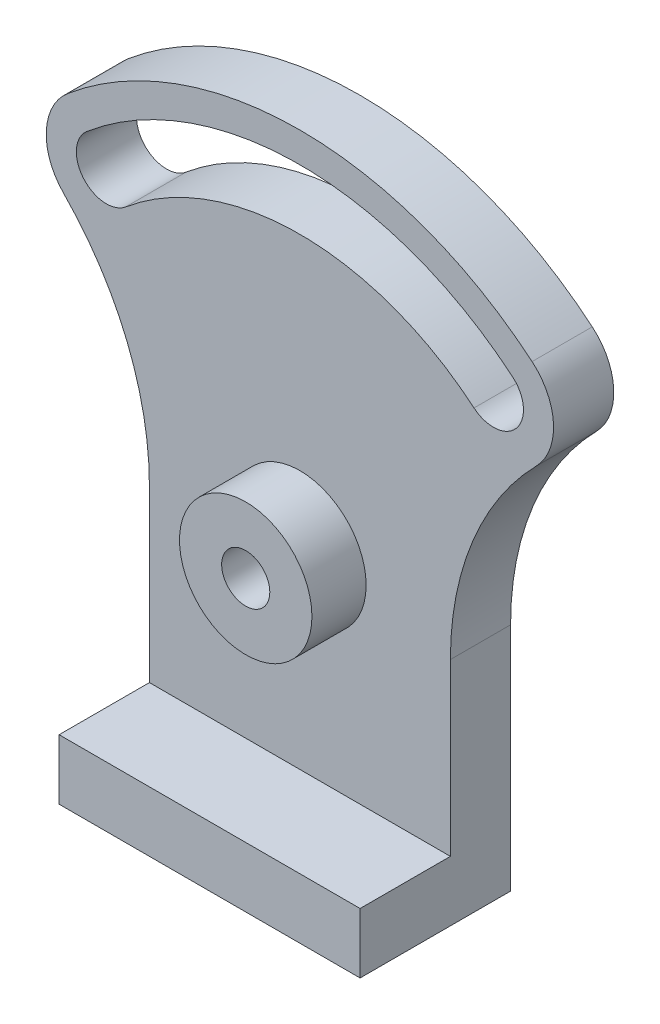
ISO-10303-21;
HEADER;
FILE_DESCRIPTION(('STEP AP214'),'2;1');
FILE_NAME('part.step','',(''),(''),'','','');
FILE_SCHEMA(('AUTOMOTIVE_DESIGN { 1 0 10303 214 1 1 1 1 }'));
ENDSEC;
DATA;
#1=APPLICATION_CONTEXT('core data for automotive mechanical design processes');
#2=APPLICATION_PROTOCOL_DEFINITION('international standard','automotive_design',2000,#1);
#3=PRODUCT_CONTEXT('',#1,'mechanical');
#4=PRODUCT('Part','Part','',(#3));
#5=PRODUCT_RELATED_PRODUCT_CATEGORY('part','',(#4));
#6=PRODUCT_DEFINITION_FORMATION('','',#4);
#7=PRODUCT_DEFINITION_CONTEXT('part definition',#1,'design');
#8=PRODUCT_DEFINITION('design','',#6,#7);
#9=PRODUCT_DEFINITION_SHAPE('','',#8);
#10=(LENGTH_UNIT() NAMED_UNIT(*) SI_UNIT(.MILLI.,.METRE.));
#11=(NAMED_UNIT(*) PLANE_ANGLE_UNIT() SI_UNIT($,.RADIAN.));
#12=(NAMED_UNIT(*) SI_UNIT($,.STERADIAN.) SOLID_ANGLE_UNIT());
#13=UNCERTAINTY_MEASURE_WITH_UNIT(LENGTH_MEASURE(1.E-05),#10,'distance_accuracy_value','');
#14=(GEOMETRIC_REPRESENTATION_CONTEXT(3) GLOBAL_UNCERTAINTY_ASSIGNED_CONTEXT((#13)) GLOBAL_UNIT_ASSIGNED_CONTEXT((#10,
#11,#12)) REPRESENTATION_CONTEXT('',''));
#15=CARTESIAN_POINT('',(0.,0.,0.));
#16=DIRECTION('',(0.,0.,1.));
#17=DIRECTION('',(1.,0.,0.));
#18=AXIS2_PLACEMENT_3D('',#15,#16,#17);
#19=CARTESIAN_POINT('',(-32.139380484327,38.3022221559488,10.));
#20=DIRECTION('',(0.,0.,-1.));
#21=DIRECTION('',(-1.,0.,0.));
#22=AXIS2_PLACEMENT_3D('',#19,#20,#21);
#23=CYLINDRICAL_SURFACE('',#22,5.);
#24=CARTESIAN_POINT('',(-32.139380484327,38.3022221559488,0.));
#25=DIRECTION('',(0.,0.,1.));
#26=DIRECTION('',(1.,0.,0.));
#27=AXIS2_PLACEMENT_3D('',#24,#25,#26);
#28=CIRCLE('',#27,5.);
#29=CARTESIAN_POINT('',(-35.3533185327598,42.1324443715437,0.));
#30=VERTEX_POINT('',#29);
#31=CARTESIAN_POINT('',(-28.9254424358944,34.471999940354,0.));
#32=VERTEX_POINT('',#31);
#33=EDGE_CURVE('E177',#30,#32,#28,.T.);
#34=ORIENTED_EDGE('',*,*,#33,.F.);
#35=DIRECTION('',(0.,0.,-1.));
#36=VECTOR('',#35,1.);
#37=CARTESIAN_POINT('',(-35.3533185327598,42.1324443715437,10.));
#38=LINE('',#37,#36);
#39=CARTESIAN_POINT('',(-35.3533185327598,42.1324443715437,10.));
#40=VERTEX_POINT('',#39);
#41=EDGE_CURVE('E11',#40,#30,#38,.T.);
#42=ORIENTED_EDGE('',*,*,#41,.F.);
#43=CARTESIAN_POINT('',(-32.139380484327,38.3022221559488,10.));
#44=DIRECTION('',(0.,0.,1.));
#45=DIRECTION('',(1.,0.,0.));
#46=AXIS2_PLACEMENT_3D('',#43,#44,#45);
#47=CIRCLE('',#46,5.);
#48=CARTESIAN_POINT('',(-28.9254424358944,34.471999940354,10.));
#49=VERTEX_POINT('',#48);
#50=EDGE_CURVE('E150',#40,#49,#47,.T.);
#51=ORIENTED_EDGE('',*,*,#50,.T.);
#52=DIRECTION('',(0.,0.,-1.));
#53=VECTOR('',#52,1.);
#54=CARTESIAN_POINT('',(-28.9254424358944,34.471999940354,10.));
#55=LINE('',#54,#53);
#56=EDGE_CURVE('E103',#49,#32,#55,.T.);
#57=ORIENTED_EDGE('',*,*,#56,.T.);
#58=EDGE_LOOP('',(#34,#42,#51,#57));
#59=FACE_BOUND('',#58,.T.);
#60=ADVANCED_FACE('F43',(#59),#23,.F.);
#61=CARTESIAN_POINT('',(0.,0.,10.));
#62=DIRECTION('',(0.,0.,-1.));
#63=DIRECTION('',(-1.,0.,0.));
#64=AXIS2_PLACEMENT_3D('',#61,#62,#63);
#65=CYLINDRICAL_SURFACE('',#64,55.);
#66=CARTESIAN_POINT('',(0.,0.,0.));
#67=DIRECTION('',(0.,0.,1.));
#68=DIRECTION('',(1.,0.,0.));
#69=AXIS2_PLACEMENT_3D('',#66,#67,#68);
#70=CIRCLE('',#69,55.);
#71=CARTESIAN_POINT('',(35.3533185327598,42.1324443715437,0.));
#72=VERTEX_POINT('',#71);
#73=EDGE_CURVE('E142',#72,#30,#70,.T.);
#74=ORIENTED_EDGE('',*,*,#73,.F.);
#75=DIRECTION('',(0.,0.,-1.));
#76=VECTOR('',#75,1.);
#77=CARTESIAN_POINT('',(35.3533185327598,42.1324443715437,10.));
#78=LINE('',#77,#76);
#79=CARTESIAN_POINT('',(35.3533185327598,42.1324443715437,10.));
#80=VERTEX_POINT('',#79);
#81=EDGE_CURVE('E53',#80,#72,#78,.T.);
#82=ORIENTED_EDGE('',*,*,#81,.F.);
#83=CARTESIAN_POINT('',(0.,0.,10.));
#84=DIRECTION('',(0.,0.,1.));
#85=DIRECTION('',(1.,0.,0.));
#86=AXIS2_PLACEMENT_3D('',#83,#84,#85);
#87=CIRCLE('',#86,55.);
#88=EDGE_CURVE('E140',#80,#40,#87,.T.);
#89=ORIENTED_EDGE('',*,*,#88,.T.);
#90=ORIENTED_EDGE('',*,*,#41,.T.);
#91=EDGE_LOOP('',(#74,#82,#89,#90));
#92=FACE_BOUND('',#91,.T.);
#93=ADVANCED_FACE('F139',(#92),#65,.F.);
#94=CARTESIAN_POINT('',(32.139380484327,38.3022221559488,10.));
#95=DIRECTION('',(0.,0.,-1.));
#96=DIRECTION('',(-1.,0.,0.));
#97=AXIS2_PLACEMENT_3D('',#94,#95,#96);
#98=CYLINDRICAL_SURFACE('',#97,5.);
#99=CARTESIAN_POINT('',(32.139380484327,38.3022221559488,0.));
#100=DIRECTION('',(0.,0.,1.));
#101=DIRECTION('',(1.,0.,0.));
#102=AXIS2_PLACEMENT_3D('',#99,#100,#101);
#103=CIRCLE('',#102,5.);
#104=CARTESIAN_POINT('',(28.9254424358943,34.471999940354,0.));
#105=VERTEX_POINT('',#104);
#106=EDGE_CURVE('E181',#105,#72,#103,.T.);
#107=ORIENTED_EDGE('',*,*,#106,.F.);
#108=DIRECTION('',(0.,0.,-1.));
#109=VECTOR('',#108,1.);
#110=CARTESIAN_POINT('',(28.9254424358943,34.471999940354,10.));
#111=LINE('',#110,#109);
#112=CARTESIAN_POINT('',(28.9254424358943,34.471999940354,10.));
#113=VERTEX_POINT('',#112);
#114=EDGE_CURVE('E96',#113,#105,#111,.T.);
#115=ORIENTED_EDGE('',*,*,#114,.F.);
#116=CARTESIAN_POINT('',(32.139380484327,38.3022221559488,10.));
#117=DIRECTION('',(0.,0.,1.));
#118=DIRECTION('',(1.,0.,0.));
#119=AXIS2_PLACEMENT_3D('',#116,#117,#118);
#120=CIRCLE('',#119,5.);
#121=EDGE_CURVE('E149',#113,#80,#120,.T.);
#122=ORIENTED_EDGE('',*,*,#121,.T.);
#123=ORIENTED_EDGE('',*,*,#81,.T.);
#124=EDGE_LOOP('',(#107,#115,#122,#123));
#125=FACE_BOUND('',#124,.T.);
#126=ADVANCED_FACE('F152',(#125),#98,.F.);
#127=CARTESIAN_POINT('',(75.,-3.68548193385244,10.));
#128=DIRECTION('',(0.,0.,-1.));
#129=DIRECTION('',(-1.,0.,0.));
#130=AXIS2_PLACEMENT_3D('',#127,#128,#129);
#131=CYLINDRICAL_SURFACE('',#130,50.);
#132=CARTESIAN_POINT('',(75.,-3.68548193385244,0.));
#133=DIRECTION('',(0.,0.,1.));
#134=DIRECTION('',(1.,0.,0.));
#135=AXIS2_PLACEMENT_3D('',#132,#133,#134);
#136=CIRCLE('',#135,50.);
#137=CARTESIAN_POINT('',(25.,-3.68548193385244,0.));
#138=VERTEX_POINT('',#137);
#139=CARTESIAN_POINT('',(39.2828170702725,31.3042714743153,0.));
#140=VERTEX_POINT('',#139);
#141=EDGE_CURVE('E158',#138,#140,#136,.F.);
#142=ORIENTED_EDGE('',*,*,#141,.T.);
#143=DIRECTION('',(0.,0.,-1.));
#144=VECTOR('',#143,1.);
#145=CARTESIAN_POINT('',(39.2828170702725,31.3042714743153,10.));
#146=LINE('',#145,#144);
#147=CARTESIAN_POINT('',(39.2828170702725,31.3042714743153,10.));
#148=VERTEX_POINT('',#147);
#149=EDGE_CURVE('E47',#148,#140,#146,.T.);
#150=ORIENTED_EDGE('',*,*,#149,.F.);
#151=CARTESIAN_POINT('',(75.,-3.68548193385244,10.));
#152=DIRECTION('',(0.,0.,1.));
#153=DIRECTION('',(1.,0.,0.));
#154=AXIS2_PLACEMENT_3D('',#151,#152,#153);
#155=CIRCLE('',#154,50.);
#156=CARTESIAN_POINT('',(25.,-3.68548193385244,10.));
#157=VERTEX_POINT('',#156);
#158=EDGE_CURVE('E185',#157,#148,#155,.F.);
#159=ORIENTED_EDGE('',*,*,#158,.F.);
#160=DIRECTION('',(0.,0.,-1.));
#161=VECTOR('',#160,1.);
#162=CARTESIAN_POINT('',(25.,-3.68548193385244,10.));
#163=LINE('',#162,#161);
#164=EDGE_CURVE('E154',#157,#138,#163,.T.);
#165=ORIENTED_EDGE('',*,*,#164,.T.);
#166=EDGE_LOOP('',(#142,#150,#159,#165));
#167=FACE_BOUND('',#166,.T.);
#168=ADVANCED_FACE('F45',(#167),#131,.F.);
#169=CARTESIAN_POINT('',(32.139380484327,38.3022221559488,10.));
#170=DIRECTION('',(0.,0.,-1.));
#171=DIRECTION('',(-1.,0.,0.));
#172=AXIS2_PLACEMENT_3D('',#169,#170,#171);
#173=CYLINDRICAL_SURFACE('',#172,10.);
#174=CARTESIAN_POINT('',(32.139380484327,38.3022221559488,0.));
#175=DIRECTION('',(0.,0.,1.));
#176=DIRECTION('',(1.,0.,0.));
#177=AXIS2_PLACEMENT_3D('',#174,#175,#176);
#178=CIRCLE('',#177,10.);
#179=CARTESIAN_POINT('',(38.5672565811925,45.9626665871386,0.));
#180=VERTEX_POINT('',#179);
#181=EDGE_CURVE('E161',#140,#180,#178,.T.);
#182=ORIENTED_EDGE('',*,*,#181,.T.);
#183=DIRECTION('',(0.,0.,-1.));
#184=VECTOR('',#183,1.);
#185=CARTESIAN_POINT('',(38.5672565811925,45.9626665871386,10.));
#186=LINE('',#185,#184);
#187=CARTESIAN_POINT('',(38.5672565811925,45.9626665871386,10.));
#188=VERTEX_POINT('',#187);
#189=EDGE_CURVE('E196',#188,#180,#186,.T.);
#190=ORIENTED_EDGE('',*,*,#189,.F.);
#191=CARTESIAN_POINT('',(32.139380484327,38.3022221559488,10.));
#192=DIRECTION('',(0.,0.,1.));
#193=DIRECTION('',(1.,0.,0.));
#194=AXIS2_PLACEMENT_3D('',#191,#192,#193);
#195=CIRCLE('',#194,10.);
#196=EDGE_CURVE('E111',#148,#188,#195,.T.);
#197=ORIENTED_EDGE('',*,*,#196,.F.);
#198=ORIENTED_EDGE('',*,*,#149,.T.);
#199=EDGE_LOOP('',(#182,#190,#197,#198));
#200=FACE_BOUND('',#199,.T.);
#201=ADVANCED_FACE('F202',(#200),#173,.T.);
#202=CARTESIAN_POINT('',(0.,0.,10.));
#203=DIRECTION('',(0.,0.,-1.));
#204=DIRECTION('',(-1.,0.,0.));
#205=AXIS2_PLACEMENT_3D('',#202,#203,#204);
#206=CYLINDRICAL_SURFACE('',#205,60.);
#207=CARTESIAN_POINT('',(0.,0.,0.));
#208=DIRECTION('',(0.,0.,1.));
#209=DIRECTION('',(1.,0.,0.));
#210=AXIS2_PLACEMENT_3D('',#207,#208,#209);
#211=CIRCLE('',#210,60.);
#212=CARTESIAN_POINT('',(-38.5672565811925,45.9626665871386,0.));
#213=VERTEX_POINT('',#212);
#214=EDGE_CURVE('E164',#180,#213,#211,.T.);
#215=ORIENTED_EDGE('',*,*,#214,.T.);
#216=DIRECTION('',(0.,0.,-1.));
#217=VECTOR('',#216,1.);
#218=CARTESIAN_POINT('',(-38.5672565811925,45.9626665871386,10.));
#219=LINE('',#218,#217);
#220=CARTESIAN_POINT('',(-38.5672565811925,45.9626665871386,10.));
#221=VERTEX_POINT('',#220);
#222=EDGE_CURVE('E194',#221,#213,#219,.T.);
#223=ORIENTED_EDGE('',*,*,#222,.F.);
#224=CARTESIAN_POINT('',(0.,0.,10.));
#225=DIRECTION('',(0.,0.,1.));
#226=DIRECTION('',(1.,0.,0.));
#227=AXIS2_PLACEMENT_3D('',#224,#225,#226);
#228=CIRCLE('',#227,60.);
#229=EDGE_CURVE('E226',#188,#221,#228,.T.);
#230=ORIENTED_EDGE('',*,*,#229,.F.);
#231=ORIENTED_EDGE('',*,*,#189,.T.);
#232=EDGE_LOOP('',(#215,#223,#230,#231));
#233=FACE_BOUND('',#232,.T.);
#234=ADVANCED_FACE('F216',(#233),#206,.T.);
#235=CARTESIAN_POINT('',(-32.139380484327,38.3022221559488,10.));
#236=DIRECTION('',(0.,0.,-1.));
#237=DIRECTION('',(-1.,0.,0.));
#238=AXIS2_PLACEMENT_3D('',#235,#236,#237);
#239=CYLINDRICAL_SURFACE('',#238,10.);
#240=CARTESIAN_POINT('',(-32.139380484327,38.3022221559488,0.));
#241=DIRECTION('',(0.,0.,1.));
#242=DIRECTION('',(1.,0.,0.));
#243=AXIS2_PLACEMENT_3D('',#240,#241,#242);
#244=CIRCLE('',#243,10.);
#245=CARTESIAN_POINT('',(-39.2828170702725,31.3042714743153,0.));
#246=VERTEX_POINT('',#245);
#247=EDGE_CURVE('E166',#213,#246,#244,.T.);
#248=ORIENTED_EDGE('',*,*,#247,.T.);
#249=DIRECTION('',(0.,0.,-1.));
#250=VECTOR('',#249,1.);
#251=CARTESIAN_POINT('',(-39.2828170702725,31.3042714743153,10.));
#252=LINE('',#251,#250);
#253=CARTESIAN_POINT('',(-39.2828170702725,31.3042714743153,10.));
#254=VERTEX_POINT('',#253);
#255=EDGE_CURVE('E192',#254,#246,#252,.T.);
#256=ORIENTED_EDGE('',*,*,#255,.F.);
#257=CARTESIAN_POINT('',(-32.139380484327,38.3022221559488,10.));
#258=DIRECTION('',(0.,0.,1.));
#259=DIRECTION('',(1.,0.,0.));
#260=AXIS2_PLACEMENT_3D('',#257,#258,#259);
#261=CIRCLE('',#260,10.);
#262=EDGE_CURVE('E221',#221,#254,#261,.T.);
#263=ORIENTED_EDGE('',*,*,#262,.F.);
#264=ORIENTED_EDGE('',*,*,#222,.T.);
#265=EDGE_LOOP('',(#248,#256,#263,#264));
#266=FACE_BOUND('',#265,.T.);
#267=ADVANCED_FACE('F219',(#266),#239,.T.);
#268=CARTESIAN_POINT('',(-75.,-3.68548193385244,10.));
#269=DIRECTION('',(0.,0.,-1.));
#270=DIRECTION('',(-1.,0.,0.));
#271=AXIS2_PLACEMENT_3D('',#268,#269,#270);
#272=CYLINDRICAL_SURFACE('',#271,50.);
#273=CARTESIAN_POINT('',(-75.,-3.68548193385244,0.));
#274=DIRECTION('',(0.,0.,1.));
#275=DIRECTION('',(1.,0.,0.));
#276=AXIS2_PLACEMENT_3D('',#273,#274,#275);
#277=CIRCLE('',#276,50.);
#278=CARTESIAN_POINT('',(-25.,-3.68548193385244,0.));
#279=VERTEX_POINT('',#278);
#280=EDGE_CURVE('E169',#279,#246,#277,.T.);
#281=ORIENTED_EDGE('',*,*,#280,.F.);
#282=DIRECTION('',(0.,0.,-1.));
#283=VECTOR('',#282,1.);
#284=CARTESIAN_POINT('',(-25.,-3.68548193385244,10.));
#285=LINE('',#284,#283);
#286=CARTESIAN_POINT('',(-25.,-3.68548193385244,10.));
#287=VERTEX_POINT('',#286);
#288=EDGE_CURVE('E190',#287,#279,#285,.T.);
#289=ORIENTED_EDGE('',*,*,#288,.F.);
#290=CARTESIAN_POINT('',(-75.,-3.68548193385244,10.));
#291=DIRECTION('',(0.,0.,1.));
#292=DIRECTION('',(1.,0.,0.));
#293=AXIS2_PLACEMENT_3D('',#290,#291,#292);
#294=CIRCLE('',#293,50.);
#295=EDGE_CURVE('E225',#287,#254,#294,.T.);
#296=ORIENTED_EDGE('',*,*,#295,.T.);
#297=ORIENTED_EDGE('',*,*,#255,.T.);
#298=EDGE_LOOP('',(#281,#289,#296,#297));
#299=FACE_BOUND('',#298,.T.);
#300=ADVANCED_FACE('F266',(#299),#272,.F.);
#301=CARTESIAN_POINT('',(-25.,0.,10.));
#302=DIRECTION('',(-1.,0.,0.));
#303=DIRECTION('',(0.,0.,1.));
#304=AXIS2_PLACEMENT_3D('',#301,#302,#303);
#305=PLANE('',#304);
#306=DIRECTION('',(0.,1.,0.));
#307=VECTOR('',#306,1.);
#308=CARTESIAN_POINT('',(-25.,0.,0.));
#309=LINE('',#308,#307);
#310=CARTESIAN_POINT('',(-25.,-42.,0.));
#311=VERTEX_POINT('',#310);
#312=EDGE_CURVE('E172',#311,#279,#309,.T.);
#313=ORIENTED_EDGE('',*,*,#312,.F.);
#314=DIRECTION('',(0.,0.,-1.));
#315=VECTOR('',#314,1.);
#316=CARTESIAN_POINT('',(-25.,-42.,25.));
#317=LINE('',#316,#315);
#318=CARTESIAN_POINT('',(-25.,-42.,25.));
#319=VERTEX_POINT('',#318);
#320=EDGE_CURVE('E162',#319,#311,#317,.T.);
#321=ORIENTED_EDGE('',*,*,#320,.F.);
#322=DIRECTION('',(0.,1.,0.));
#323=VECTOR('',#322,1.);
#324=CARTESIAN_POINT('',(-25.,0.,25.));
#325=LINE('',#324,#323);
#326=CARTESIAN_POINT('',(-25.,-32.,25.));
#327=VERTEX_POINT('',#326);
#328=EDGE_CURVE('E478',#319,#327,#325,.T.);
#329=ORIENTED_EDGE('',*,*,#328,.T.);
#330=DIRECTION('',(0.,0.,-1.));
#331=VECTOR('',#330,1.);
#332=CARTESIAN_POINT('',(-25.,-32.,25.));
#333=LINE('',#332,#331);
#334=CARTESIAN_POINT('',(-25.,-32.,10.));
#335=VERTEX_POINT('',#334);
#336=EDGE_CURVE('E495',#327,#335,#333,.T.);
#337=ORIENTED_EDGE('',*,*,#336,.T.);
#338=DIRECTION('',(0.,1.,0.));
#339=VECTOR('',#338,1.);
#340=CARTESIAN_POINT('',(-25.,0.,10.));
#341=LINE('',#340,#339);
#342=EDGE_CURVE('E228',#335,#287,#341,.T.);
#343=ORIENTED_EDGE('',*,*,#342,.T.);
#344=ORIENTED_EDGE('',*,*,#288,.T.);
#345=EDGE_LOOP('',(#313,#321,#329,#337,#343,#344));
#346=FACE_BOUND('',#345,.T.);
#347=ADVANCED_FACE('F252',(#346),#305,.T.);
#348=CARTESIAN_POINT('',(25.,0.,10.));
#349=DIRECTION('',(-1.,0.,0.));
#350=DIRECTION('',(0.,0.,1.));
#351=AXIS2_PLACEMENT_3D('',#348,#349,#350);
#352=PLANE('',#351);
#353=DIRECTION('',(0.,1.,0.));
#354=VECTOR('',#353,1.);
#355=CARTESIAN_POINT('',(25.,0.,0.));
#356=LINE('',#355,#354);
#357=CARTESIAN_POINT('',(25.,-42.,0.));
#358=VERTEX_POINT('',#357);
#359=EDGE_CURVE('E175',#358,#138,#356,.T.);
#360=ORIENTED_EDGE('',*,*,#359,.T.);
#361=ORIENTED_EDGE('',*,*,#164,.F.);
#362=DIRECTION('',(0.,1.,0.));
#363=VECTOR('',#362,1.);
#364=CARTESIAN_POINT('',(25.,0.,10.));
#365=LINE('',#364,#363);
#366=CARTESIAN_POINT('',(25.,-32.,10.));
#367=VERTEX_POINT('',#366);
#368=EDGE_CURVE('E238',#367,#157,#365,.T.);
#369=ORIENTED_EDGE('',*,*,#368,.F.);
#370=DIRECTION('',(0.,0.,-1.));
#371=VECTOR('',#370,1.);
#372=CARTESIAN_POINT('',(25.,-32.,25.));
#373=LINE('',#372,#371);
#374=CARTESIAN_POINT('',(25.,-32.,25.));
#375=VERTEX_POINT('',#374);
#376=EDGE_CURVE('E499',#375,#367,#373,.T.);
#377=ORIENTED_EDGE('',*,*,#376,.F.);
#378=DIRECTION('',(0.,1.,0.));
#379=VECTOR('',#378,1.);
#380=CARTESIAN_POINT('',(25.,0.,25.));
#381=LINE('',#380,#379);
#382=CARTESIAN_POINT('',(25.,-42.,25.));
#383=VERTEX_POINT('',#382);
#384=EDGE_CURVE('E490',#383,#375,#381,.T.);
#385=ORIENTED_EDGE('',*,*,#384,.F.);
#386=DIRECTION('',(0.,0.,-1.));
#387=VECTOR('',#386,1.);
#388=CARTESIAN_POINT('',(25.,-42.,25.));
#389=LINE('',#388,#387);
#390=EDGE_CURVE('E501',#383,#358,#389,.T.);
#391=ORIENTED_EDGE('',*,*,#390,.T.);
#392=EDGE_LOOP('',(#360,#361,#369,#377,#385,#391));
#393=FACE_BOUND('',#392,.T.);
#394=ADVANCED_FACE('F245',(#393),#352,.F.);
#395=CARTESIAN_POINT('',(0.,0.,10.));
#396=DIRECTION('',(0.,0.,-1.));
#397=DIRECTION('',(-1.,0.,0.));
#398=AXIS2_PLACEMENT_3D('',#395,#396,#397);
#399=CYLINDRICAL_SURFACE('',#398,45.);
#400=CARTESIAN_POINT('',(0.,0.,0.));
#401=DIRECTION('',(0.,0.,1.));
#402=DIRECTION('',(1.,0.,0.));
#403=AXIS2_PLACEMENT_3D('',#400,#401,#402);
#404=CIRCLE('',#403,45.);
#405=EDGE_CURVE('E183',#105,#32,#404,.T.);
#406=ORIENTED_EDGE('',*,*,#405,.T.);
#407=ORIENTED_EDGE('',*,*,#56,.F.);
#408=CARTESIAN_POINT('',(0.,0.,10.));
#409=DIRECTION('',(0.,0.,1.));
#410=DIRECTION('',(1.,0.,0.));
#411=AXIS2_PLACEMENT_3D('',#408,#409,#410);
#412=CIRCLE('',#411,45.);
#413=EDGE_CURVE('E62',#113,#49,#412,.T.);
#414=ORIENTED_EDGE('',*,*,#413,.F.);
#415=ORIENTED_EDGE('',*,*,#114,.T.);
#416=EDGE_LOOP('',(#406,#407,#414,#415));
#417=FACE_BOUND('',#416,.T.);
#418=ADVANCED_FACE('F243',(#417),#399,.T.);
#419=CARTESIAN_POINT('',(0.,0.,10.));
#420=DIRECTION('',(0.,0.,1.));
#421=DIRECTION('',(1.,0.,0.));
#422=AXIS2_PLACEMENT_3D('',#419,#420,#421);
#423=PLANE('',#422);
#424=ORIENTED_EDGE('',*,*,#158,.T.);
#425=ORIENTED_EDGE('',*,*,#196,.T.);
#426=ORIENTED_EDGE('',*,*,#229,.T.);
#427=ORIENTED_EDGE('',*,*,#262,.T.);
#428=ORIENTED_EDGE('',*,*,#295,.F.);
#429=ORIENTED_EDGE('',*,*,#342,.F.);
#430=DIRECTION('',(1.,0.,0.));
#431=VECTOR('',#430,1.);
#432=CARTESIAN_POINT('',(0.,-32.,10.));
#433=LINE('',#432,#431);
#434=EDGE_CURVE('E235',#335,#367,#433,.T.);
#435=ORIENTED_EDGE('',*,*,#434,.T.);
#436=ORIENTED_EDGE('',*,*,#368,.T.);
#437=EDGE_LOOP('',(#424,#425,#426,#427,#428,#429,#435,#436));
#438=FACE_BOUND('',#437,.T.);
#439=CARTESIAN_POINT('',(0.,0.,10.));
#440=DIRECTION('',(0.,0.,1.));
#441=DIRECTION('',(1.,0.,0.));
#442=AXIS2_PLACEMENT_3D('',#439,#440,#441);
#443=CIRCLE('',#442,11.);
#444=CARTESIAN_POINT('',(11.,0.,10.));
#445=VERTEX_POINT('',#444);
#446=EDGE_CURVE('E240',#445,#445,#443,.T.);
#447=ORIENTED_EDGE('',*,*,#446,.F.);
#448=EDGE_LOOP('',(#447));
#449=FACE_BOUND('',#448,.T.);
#450=ORIENTED_EDGE('',*,*,#50,.F.);
#451=ORIENTED_EDGE('',*,*,#88,.F.);
#452=ORIENTED_EDGE('',*,*,#121,.F.);
#453=ORIENTED_EDGE('',*,*,#413,.T.);
#454=EDGE_LOOP('',(#450,#451,#452,#453));
#455=FACE_BOUND('',#454,.T.);
#456=ADVANCED_FACE('F148',(#438,#449,#455),#423,.T.);
#457=CARTESIAN_POINT('',(0.,0.,0.));
#458=DIRECTION('',(0.,0.,1.));
#459=DIRECTION('',(1.,0.,0.));
#460=AXIS2_PLACEMENT_3D('',#457,#458,#459);
#461=PLANE('',#460);
#462=ORIENTED_EDGE('',*,*,#141,.F.);
#463=ORIENTED_EDGE('',*,*,#359,.F.);
#464=DIRECTION('',(1.,0.,0.));
#465=VECTOR('',#464,1.);
#466=CARTESIAN_POINT('',(0.,-42.,0.));
#467=LINE('',#466,#465);
#468=EDGE_CURVE('E476',#311,#358,#467,.T.);
#469=ORIENTED_EDGE('',*,*,#468,.F.);
#470=ORIENTED_EDGE('',*,*,#312,.T.);
#471=ORIENTED_EDGE('',*,*,#280,.T.);
#472=ORIENTED_EDGE('',*,*,#247,.F.);
#473=ORIENTED_EDGE('',*,*,#214,.F.);
#474=ORIENTED_EDGE('',*,*,#181,.F.);
#475=EDGE_LOOP('',(#462,#463,#469,#470,#471,#472,#473,#474));
#476=FACE_BOUND('',#475,.T.);
#477=ORIENTED_EDGE('',*,*,#33,.T.);
#478=ORIENTED_EDGE('',*,*,#405,.F.);
#479=ORIENTED_EDGE('',*,*,#106,.T.);
#480=ORIENTED_EDGE('',*,*,#73,.T.);
#481=EDGE_LOOP('',(#477,#478,#479,#480));
#482=FACE_BOUND('',#481,.T.);
#483=CARTESIAN_POINT('',(0.,0.,0.));
#484=DIRECTION('',(0.,0.,1.));
#485=DIRECTION('',(1.,0.,0.));
#486=AXIS2_PLACEMENT_3D('',#483,#484,#485);
#487=CIRCLE('',#486,4.);
#488=CARTESIAN_POINT('',(4.,0.,0.));
#489=VERTEX_POINT('',#488);
#490=EDGE_CURVE('E480',#489,#489,#487,.T.);
#491=ORIENTED_EDGE('',*,*,#490,.T.);
#492=EDGE_LOOP('',(#491));
#493=FACE_BOUND('',#492,.T.);
#494=ADVANCED_FACE('F209',(#476,#482,#493),#461,.F.);
#495=CARTESIAN_POINT('',(0.,-32.,25.));
#496=DIRECTION('',(0.,1.,0.));
#497=DIRECTION('',(0.,0.,1.));
#498=AXIS2_PLACEMENT_3D('',#495,#496,#497);
#499=PLANE('',#498);
#500=ORIENTED_EDGE('',*,*,#434,.F.);
#501=ORIENTED_EDGE('',*,*,#336,.F.);
#502=DIRECTION('',(1.,0.,0.));
#503=VECTOR('',#502,1.);
#504=CARTESIAN_POINT('',(0.,-32.,25.));
#505=LINE('',#504,#503);
#506=EDGE_CURVE('E493',#327,#375,#505,.T.);
#507=ORIENTED_EDGE('',*,*,#506,.T.);
#508=ORIENTED_EDGE('',*,*,#376,.T.);
#509=EDGE_LOOP('',(#500,#501,#507,#508));
#510=FACE_BOUND('',#509,.T.);
#511=ADVANCED_FACE('F359',(#510),#499,.T.);
#512=CARTESIAN_POINT('',(0.,-42.,25.));
#513=DIRECTION('',(0.,1.,0.));
#514=DIRECTION('',(0.,0.,1.));
#515=AXIS2_PLACEMENT_3D('',#512,#513,#514);
#516=PLANE('',#515);
#517=ORIENTED_EDGE('',*,*,#468,.T.);
#518=ORIENTED_EDGE('',*,*,#390,.F.);
#519=DIRECTION('',(1.,0.,0.));
#520=VECTOR('',#519,1.);
#521=CARTESIAN_POINT('',(0.,-42.,25.));
#522=LINE('',#521,#520);
#523=EDGE_CURVE('E487',#319,#383,#522,.T.);
#524=ORIENTED_EDGE('',*,*,#523,.F.);
#525=ORIENTED_EDGE('',*,*,#320,.T.);
#526=EDGE_LOOP('',(#517,#518,#524,#525));
#527=FACE_BOUND('',#526,.T.);
#528=ADVANCED_FACE('F367',(#527),#516,.F.);
#529=CARTESIAN_POINT('',(0.,0.,25.));
#530=DIRECTION('',(0.,0.,1.));
#531=DIRECTION('',(1.,0.,0.));
#532=AXIS2_PLACEMENT_3D('',#529,#530,#531);
#533=PLANE('',#532);
#534=ORIENTED_EDGE('',*,*,#328,.F.);
#535=ORIENTED_EDGE('',*,*,#523,.T.);
#536=ORIENTED_EDGE('',*,*,#384,.T.);
#537=ORIENTED_EDGE('',*,*,#506,.F.);
#538=EDGE_LOOP('',(#534,#535,#536,#537));
#539=FACE_BOUND('',#538,.T.);
#540=ADVANCED_FACE('F378',(#539),#533,.T.);
#541=CARTESIAN_POINT('',(0.,0.,19.));
#542=DIRECTION('',(0.,0.,-1.));
#543=DIRECTION('',(-1.,0.,0.));
#544=AXIS2_PLACEMENT_3D('',#541,#542,#543);
#545=CYLINDRICAL_SURFACE('',#544,4.);
#546=CARTESIAN_POINT('',(0.,0.,19.));
#547=DIRECTION('',(0.,0.,1.));
#548=DIRECTION('',(1.,0.,0.));
#549=AXIS2_PLACEMENT_3D('',#546,#547,#548);
#550=CIRCLE('',#549,4.);
#551=CARTESIAN_POINT('',(4.,0.,19.));
#552=VERTEX_POINT('',#551);
#553=EDGE_CURVE('E471',#552,#552,#550,.T.);
#554=ORIENTED_EDGE('',*,*,#553,.T.);
#555=EDGE_LOOP('',(#554));
#556=FACE_BOUND('',#555,.T.);
#557=ORIENTED_EDGE('',*,*,#490,.F.);
#558=EDGE_LOOP('',(#557));
#559=FACE_BOUND('',#558,.T.);
#560=ADVANCED_FACE('F388',(#556,#559),#545,.F.);
#561=CARTESIAN_POINT('',(0.,0.,19.));
#562=DIRECTION('',(0.,0.,-1.));
#563=DIRECTION('',(-1.,0.,0.));
#564=AXIS2_PLACEMENT_3D('',#561,#562,#563);
#565=CYLINDRICAL_SURFACE('',#564,11.);
#566=ORIENTED_EDGE('',*,*,#446,.T.);
#567=EDGE_LOOP('',(#566));
#568=FACE_BOUND('',#567,.T.);
#569=CARTESIAN_POINT('',(0.,0.,19.));
#570=DIRECTION('',(0.,0.,1.));
#571=DIRECTION('',(1.,0.,0.));
#572=AXIS2_PLACEMENT_3D('',#569,#570,#571);
#573=CIRCLE('',#572,11.);
#574=CARTESIAN_POINT('',(11.,0.,19.));
#575=VERTEX_POINT('',#574);
#576=EDGE_CURVE('E474',#575,#575,#573,.T.);
#577=ORIENTED_EDGE('',*,*,#576,.F.);
#578=EDGE_LOOP('',(#577));
#579=FACE_BOUND('',#578,.T.);
#580=ADVANCED_FACE('F399',(#568,#579),#565,.T.);
#581=CARTESIAN_POINT('',(0.,0.,19.));
#582=DIRECTION('',(0.,0.,1.));
#583=DIRECTION('',(1.,0.,0.));
#584=AXIS2_PLACEMENT_3D('',#581,#582,#583);
#585=PLANE('',#584);
#586=ORIENTED_EDGE('',*,*,#553,.F.);
#587=EDGE_LOOP('',(#586));
#588=FACE_BOUND('',#587,.T.);
#589=ORIENTED_EDGE('',*,*,#576,.T.);
#590=EDGE_LOOP('',(#589));
#591=FACE_BOUND('',#590,.T.);
#592=ADVANCED_FACE('F409',(#588,#591),#585,.T.);
#593=CLOSED_SHELL('',(#60,#93,#126,#168,#201,#234,#267,#300,#347,#394,#418,#456,#494,#511,#528,
#540,#560,#580,#592));
#594=MANIFOLD_SOLID_BREP('B2',#593);
#595=ADVANCED_BREP_SHAPE_REPRESENTATION('',(#18,#594),#14);
#596=SHAPE_DEFINITION_REPRESENTATION(#9,#595);
ENDSEC;
END-ISO-10303-21;
